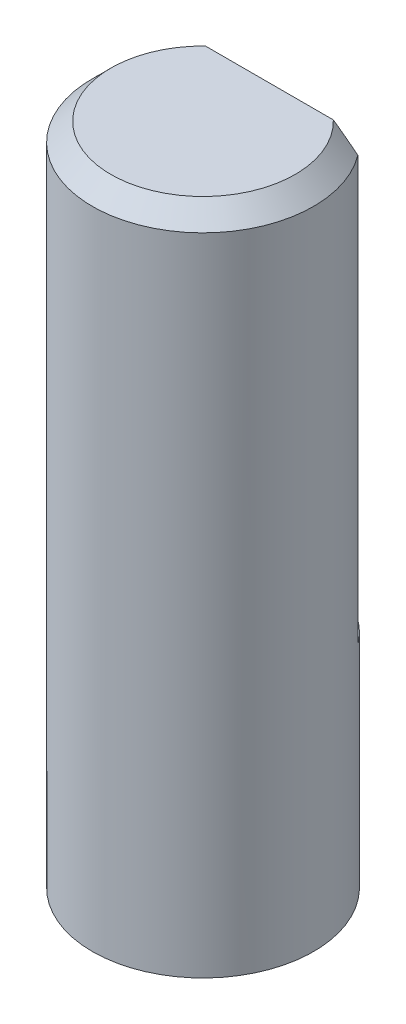
ISO-10303-21;
HEADER;
FILE_DESCRIPTION(('STEP AP214'),'2;1');
FILE_NAME('part.step','',(''),(''),'','','');
FILE_SCHEMA(('AUTOMOTIVE_DESIGN { 1 0 10303 214 1 1 1 1 }'));
ENDSEC;
DATA;
#1=APPLICATION_CONTEXT('core data for automotive mechanical design processes');
#2=APPLICATION_PROTOCOL_DEFINITION('international standard','automotive_design',2000,#1);
#3=PRODUCT_CONTEXT('',#1,'mechanical');
#4=PRODUCT('Part','Part','',(#3));
#5=PRODUCT_RELATED_PRODUCT_CATEGORY('part','',(#4));
#6=PRODUCT_DEFINITION_FORMATION('','',#4);
#7=PRODUCT_DEFINITION_CONTEXT('part definition',#1,'design');
#8=PRODUCT_DEFINITION('design','',#6,#7);
#9=PRODUCT_DEFINITION_SHAPE('','',#8);
#10=(LENGTH_UNIT() NAMED_UNIT(*) SI_UNIT(.MILLI.,.METRE.));
#11=(NAMED_UNIT(*) PLANE_ANGLE_UNIT() SI_UNIT($,.RADIAN.));
#12=(NAMED_UNIT(*) SI_UNIT($,.STERADIAN.) SOLID_ANGLE_UNIT());
#13=UNCERTAINTY_MEASURE_WITH_UNIT(LENGTH_MEASURE(1.E-05),#10,'distance_accuracy_value','');
#14=(GEOMETRIC_REPRESENTATION_CONTEXT(3) GLOBAL_UNCERTAINTY_ASSIGNED_CONTEXT((#13)) GLOBAL_UNIT_ASSIGNED_CONTEXT((#10,
#11,#12)) REPRESENTATION_CONTEXT('',''));
#15=CARTESIAN_POINT('',(0.,0.,0.));
#16=DIRECTION('',(0.,0.,1.));
#17=DIRECTION('',(1.,0.,0.));
#18=AXIS2_PLACEMENT_3D('',#15,#16,#17);
#19=CARTESIAN_POINT('',(0.,18.,0.));
#20=DIRECTION('',(0.,-1.,0.));
#21=DIRECTION('',(0.,0.,-1.));
#22=AXIS2_PLACEMENT_3D('',#19,#20,#21);
#23=CYLINDRICAL_SURFACE('',#22,3.);
#24=CARTESIAN_POINT('',(0.,17.5,0.));
#25=DIRECTION('',(0.,1.,0.));
#26=DIRECTION('',(0.,0.,1.));
#27=AXIS2_PLACEMENT_3D('',#24,#25,#26);
#28=CIRCLE('',#27,3.);
#29=CARTESIAN_POINT('',(2.4,17.5,-1.8));
#30=VERTEX_POINT('',#29);
#31=CARTESIAN_POINT('',(-2.4,17.5,-1.8));
#32=VERTEX_POINT('',#31);
#33=EDGE_CURVE('E94',#30,#32,#28,.F.);
#34=ORIENTED_EDGE('',*,*,#33,.T.);
#35=DIRECTION('',(0.,1.,0.));
#36=VECTOR('',#35,1.);
#37=CARTESIAN_POINT('',(-2.4,6.,-1.8));
#38=LINE('',#37,#36);
#39=CARTESIAN_POINT('',(-2.4,6.,-1.8));
#40=VERTEX_POINT('',#39);
#41=EDGE_CURVE('E59',#40,#32,#38,.T.);
#42=ORIENTED_EDGE('',*,*,#41,.F.);
#43=CARTESIAN_POINT('',(0.,6.,0.));
#44=DIRECTION('',(0.,1.,0.));
#45=DIRECTION('',(0.,0.,1.));
#46=AXIS2_PLACEMENT_3D('',#43,#44,#45);
#47=CIRCLE('',#46,3.);
#48=CARTESIAN_POINT('',(2.4,6.,-1.8));
#49=VERTEX_POINT('',#48);
#50=EDGE_CURVE('E79',#49,#40,#47,.T.);
#51=ORIENTED_EDGE('',*,*,#50,.F.);
#52=DIRECTION('',(0.,1.,0.));
#53=VECTOR('',#52,1.);
#54=CARTESIAN_POINT('',(2.4,6.,-1.8));
#55=LINE('',#54,#53);
#56=EDGE_CURVE('E70',#49,#30,#55,.T.);
#57=ORIENTED_EDGE('',*,*,#56,.T.);
#58=EDGE_LOOP('',(#34,#42,#51,#57));
#59=FACE_BOUND('',#58,.T.);
#60=CARTESIAN_POINT('',(0.,0.,0.));
#61=DIRECTION('',(0.,1.,0.));
#62=DIRECTION('',(0.,0.,1.));
#63=AXIS2_PLACEMENT_3D('',#60,#61,#62);
#64=CIRCLE('',#63,3.);
#65=CARTESIAN_POINT('',(0.,0.,3.));
#66=VERTEX_POINT('',#65);
#67=EDGE_CURVE('E88',#66,#66,#64,.T.);
#68=ORIENTED_EDGE('',*,*,#67,.T.);
#69=EDGE_LOOP('',(#68));
#70=FACE_BOUND('',#69,.T.);
#71=ADVANCED_FACE('F34',(#59,#70),#23,.T.);
#72=CARTESIAN_POINT('',(0.,18.,0.));
#73=DIRECTION('',(0.,1.,0.));
#74=DIRECTION('',(0.,0.,1.));
#75=AXIS2_PLACEMENT_3D('',#72,#73,#74);
#76=PLANE('',#75);
#77=DIRECTION('',(1.,0.,0.));
#78=VECTOR('',#77,1.);
#79=CARTESIAN_POINT('',(-2.4,18.,-1.8));
#80=LINE('',#79,#78);
#81=CARTESIAN_POINT('',(-1.73493515728975,18.,-1.8));
#82=VERTEX_POINT('',#81);
#83=CARTESIAN_POINT('',(1.73493515728975,18.,-1.8));
#84=VERTEX_POINT('',#83);
#85=EDGE_CURVE('E53',#82,#84,#80,.T.);
#86=ORIENTED_EDGE('',*,*,#85,.F.);
#87=CARTESIAN_POINT('',(0.,18.,0.));
#88=DIRECTION('',(0.,1.,0.));
#89=DIRECTION('',(0.,0.,1.));
#90=AXIS2_PLACEMENT_3D('',#87,#88,#89);
#91=CIRCLE('',#90,2.5);
#92=EDGE_CURVE('E92',#82,#84,#91,.T.);
#93=ORIENTED_EDGE('',*,*,#92,.T.);
#94=EDGE_LOOP('',(#86,#93));
#95=FACE_BOUND('',#94,.T.);
#96=ADVANCED_FACE('F98',(#95),#76,.T.);
#97=CARTESIAN_POINT('',(0.,0.,0.));
#98=DIRECTION('',(0.,1.,0.));
#99=DIRECTION('',(0.,0.,1.));
#100=AXIS2_PLACEMENT_3D('',#97,#98,#99);
#101=PLANE('',#100);
#102=ORIENTED_EDGE('',*,*,#67,.F.);
#103=EDGE_LOOP('',(#102));
#104=FACE_BOUND('',#103,.T.);
#105=ADVANCED_FACE('F100',(#104),#101,.F.);
#106=CARTESIAN_POINT('',(0.,18.,0.));
#107=DIRECTION('',(0.,-1.,0.));
#108=DIRECTION('',(0.,0.,-1.));
#109=AXIS2_PLACEMENT_3D('',#106,#107,#108);
#110=CONICAL_SURFACE('',#109,2.5,0.785398163397448);
#111=CARTESIAN_POINT('',(-5.29578284288328,14.9066721963596,-1.8));
#112=CARTESIAN_POINT('',(-5.12285180266291,15.0703540126584,-1.8));
#113=CARTESIAN_POINT('',(-4.94955019645599,15.2336504095275,-1.8));
#114=CARTESIAN_POINT('',(-4.60162438118305,15.5592473838574,-1.8));
#115=CARTESIAN_POINT('',(-4.42699883391852,15.7215465302245,-1.8));
#116=CARTESIAN_POINT('',(-4.06851224534989,16.0516608721901,-1.8));
#117=CARTESIAN_POINT('',(-3.88458392141662,16.2194031296405,-1.8));
#118=CARTESIAN_POINT('',(-3.51459877302508,16.552115561214,-1.8));
#119=CARTESIAN_POINT('',(-3.3285445876314,16.7170886526615,-1.8));
#120=CARTESIAN_POINT('',(-3.0469552865494,16.9613852102644,-1.8));
#121=CARTESIAN_POINT('',(-2.95274357195754,17.0422325960205,-1.8));
#122=CARTESIAN_POINT('',(-2.76320922654278,17.2026126022802,-1.8));
#123=CARTESIAN_POINT('',(-2.66788662596549,17.2821452584374,-1.8));
#124=CARTESIAN_POINT('',(-2.47547651174436,17.4397830383105,-1.8));
#125=CARTESIAN_POINT('',(-2.37838379128246,17.5178818262759,-1.8));
#126=CARTESIAN_POINT('',(-2.18237585089865,17.6717370747434,-1.8));
#127=CARTESIAN_POINT('',(-2.08346092711413,17.7474939105837,-1.8));
#128=CARTESIAN_POINT('',(-1.88532169174342,17.894219628657,-1.8));
#129=CARTESIAN_POINT('',(-1.78614736284381,17.9652556001344,-1.8));
#130=CARTESIAN_POINT('',(-1.5846683568887,18.1029700141344,-1.8));
#131=CARTESIAN_POINT('',(-1.48236132429949,18.1696450532922,-1.8));
#132=CARTESIAN_POINT('',(-1.27439518990201,18.2960736980376,-1.8));
#133=CARTESIAN_POINT('',(-1.1687613448564,18.355868364682,-1.8));
#134=CARTESIAN_POINT('',(-0.952556163795937,18.4656166003948,-1.8));
#135=CARTESIAN_POINT('',(-0.841995054764684,18.5155894860828,-1.8));
#136=CARTESIAN_POINT('',(-0.67571400546358,18.5779707744145,-1.8));
#137=CARTESIAN_POINT('',(-0.622180982305442,18.5962022888381,-1.8));
#138=CARTESIAN_POINT('',(-0.513910266480796,18.6287873383075,-1.8));
#139=CARTESIAN_POINT('',(-0.459172176697258,18.6431395736471,-1.8));
#140=CARTESIAN_POINT('',(-0.348992821062411,18.6672628138493,-1.8));
#141=CARTESIAN_POINT('',(-0.293556967868144,18.6770582049487,-1.8));
#142=CARTESIAN_POINT('',(-0.182034692593678,18.6916627606029,-1.8));
#143=CARTESIAN_POINT('',(-0.125948428950475,18.6964731147207,-1.8));
#144=CARTESIAN_POINT('',(-0.0132008668996252,18.7008386657294,-1.8));
#145=CARTESIAN_POINT('',(0.0434617950341464,18.7003593453081,-1.8));
#146=CARTESIAN_POINT('',(0.15648774149834,18.6940921780968,-1.8));
#147=CARTESIAN_POINT('',(0.212851022487892,18.6883042686605,-1.8));
#148=CARTESIAN_POINT('',(0.325096233526428,18.671724967809,-1.8));
#149=CARTESIAN_POINT('',(0.380974656979358,18.6609101918883,-1.8));
#150=CARTESIAN_POINT('',(0.491676832762132,18.6348327137508,-1.8));
#151=CARTESIAN_POINT('',(0.54650036964537,18.6195691129868,-1.8));
#152=CARTESIAN_POINT('',(0.688019766423603,18.5747703856724,-1.8));
#153=CARTESIAN_POINT('',(0.773755994279863,18.5422094516917,-1.8));
#154=CARTESIAN_POINT('',(0.942080002539032,18.4697969263594,-1.8));
#155=CARTESIAN_POINT('',(1.02466506086554,18.4299391967279,-1.8));
#156=CARTESIAN_POINT('',(1.18780091303287,18.3445424570655,-1.8));
#157=CARTESIAN_POINT('',(1.26832535988246,18.2989536643178,-1.8));
#158=CARTESIAN_POINT('',(1.38730526076978,18.2276412203138,-1.8));
#159=CARTESIAN_POINT('',(1.42665708647506,18.2033868873823,-1.8));
#160=CARTESIAN_POINT('',(1.50482372835086,18.15402980513,-1.8));
#161=CARTESIAN_POINT('',(1.54363856520485,18.1289270886157,-1.8));
#162=CARTESIAN_POINT('',(1.67182501563615,18.0443017298246,-1.8));
#163=CARTESIAN_POINT('',(1.76014213154034,17.9831809982279,-1.8));
#164=CARTESIAN_POINT('',(1.93475691237975,17.8581099630329,-1.8));
#165=CARTESIAN_POINT('',(2.02105414744676,17.7941590653449,-1.8));
#166=CARTESIAN_POINT('',(2.19210447719125,17.6641168712498,-1.8));
#167=CARTESIAN_POINT('',(2.2768565264644,17.5980242040805,-1.8));
#168=CARTESIAN_POINT('',(2.44508801948856,17.4642354600927,-1.8));
#169=CARTESIAN_POINT('',(2.52856739356204,17.3965392959989,-1.8));
#170=CARTESIAN_POINT('',(2.77799047736409,17.1911877411021,-1.8));
#171=CARTESIAN_POINT('',(2.94240007196368,17.0516713782478,-1.8));
#172=CARTESIAN_POINT('',(3.26843637260826,16.7695759942704,-1.8));
#173=CARTESIAN_POINT('',(3.43006413095913,16.6269981792333,-1.8));
#174=CARTESIAN_POINT('',(3.73546723091933,16.3539753142177,-1.8));
#175=CARTESIAN_POINT('',(3.87942213606178,16.2237307458772,-1.8));
#176=CARTESIAN_POINT('',(4.16619516720294,15.9619650961217,-1.8));
#177=CARTESIAN_POINT('',(4.30901315898711,15.830443867946,-1.8));
#178=CARTESIAN_POINT('',(4.59288247936315,15.5672779669628,-1.8));
#179=CARTESIAN_POINT('',(4.73393927099943,15.4356391790714,-1.8));
#180=CARTESIAN_POINT('',(5.0153431952258,15.1716466142537,-1.8));
#181=CARTESIAN_POINT('',(5.15569042994564,15.0392929462436,-1.8));
#182=CARTESIAN_POINT('',(5.29578284288328,14.9066721963596,-1.8));
#183=B_SPLINE_CURVE_WITH_KNOTS('',3,(#111,#112,#113,#114,#115,#116,#117,#118,#119,#120,#121,
#122,#123,#124,#125,#126,#127,#128,#129,#130,#131,#132,#133,#134,#135,#136,#137,#138,#139,#140,
#141,#142,#143,#144,#145,#146,#147,#148,#149,#150,#151,#152,#153,#154,#155,#156,#157,#158,#159,
#160,#161,#162,#163,#164,#165,#166,#167,#168,#169,#170,#171,#172,#173,#174,#175,#176,#177,#178,
#179,#180,#181,#182),.UNSPECIFIED.,.F.,.F.,(4,2,2,2,2,2,2,2,2,2,2,2,2,2,2,2,2,2,2,2,2,2,2,2,2,2,
2,2,2,2,2,2,2,2,2,4),(0.,0.714339121129969,1.4295359451444,2.17631800258365,2.92225648956363,
3.29468470304652,3.66710280016944,4.04089238896473,4.4146217576662,4.7805141986725,
5.14668886423431,5.51055046501753,5.8736891319736,6.04322842397081,6.21282444787905,
6.38150212030355,6.55013953245812,6.71987802063261,6.88961851190608,7.06015664612701,
7.23072924851931,7.50536044755127,7.7802237450112,8.05766521368626,8.19633537101629,
8.33500017216291,8.65712483021718,8.9793174302738,9.30172047707967,9.62414111215304,
10.2709512389679,10.9175110620876,11.4998923501344,12.0823413989977,12.6611581113517,
13.2398889942293),.UNSPECIFIED.);
#184=EDGE_CURVE('E11',#32,#82,#183,.T.);
#185=ORIENTED_EDGE('',*,*,#184,.F.);
#186=ORIENTED_EDGE('',*,*,#33,.F.);
#187=EDGE_CURVE('E39',#84,#30,#183,.T.);
#188=ORIENTED_EDGE('',*,*,#187,.F.);
#189=ORIENTED_EDGE('',*,*,#92,.F.);
#190=EDGE_LOOP('',(#185,#186,#188,#189));
#191=FACE_BOUND('',#190,.T.);
#192=ADVANCED_FACE('F36',(#191),#110,.T.);
#193=CARTESIAN_POINT('',(-2.4,6.,-1.8));
#194=DIRECTION('',(0.,0.,1.));
#195=DIRECTION('',(1.,0.,0.));
#196=AXIS2_PLACEMENT_3D('',#193,#194,#195);
#197=PLANE('',#196);
#198=ORIENTED_EDGE('',*,*,#184,.T.);
#199=ORIENTED_EDGE('',*,*,#85,.T.);
#200=ORIENTED_EDGE('',*,*,#187,.T.);
#201=ORIENTED_EDGE('',*,*,#56,.F.);
#202=DIRECTION('',(1.,0.,0.));
#203=VECTOR('',#202,1.);
#204=CARTESIAN_POINT('',(-2.4,6.,-1.8));
#205=LINE('',#204,#203);
#206=EDGE_CURVE('E73',#40,#49,#205,.T.);
#207=ORIENTED_EDGE('',*,*,#206,.F.);
#208=ORIENTED_EDGE('',*,*,#41,.T.);
#209=EDGE_LOOP('',(#198,#199,#200,#201,#207,#208));
#210=FACE_BOUND('',#209,.T.);
#211=ADVANCED_FACE('F72',(#210),#197,.F.);
#212=CARTESIAN_POINT('',(0.,6.,0.));
#213=DIRECTION('',(0.,1.,0.));
#214=DIRECTION('',(0.,0.,1.));
#215=AXIS2_PLACEMENT_3D('',#212,#213,#214);
#216=PLANE('',#215);
#217=ORIENTED_EDGE('',*,*,#206,.T.);
#218=ORIENTED_EDGE('',*,*,#50,.T.);
#219=EDGE_LOOP('',(#217,#218));
#220=FACE_BOUND('',#219,.T.);
#221=ADVANCED_FACE('F82',(#220),#216,.T.);
#222=CLOSED_SHELL('',(#71,#96,#105,#192,#211,#221));
#223=MANIFOLD_SOLID_BREP('B2',#222);
#224=ADVANCED_BREP_SHAPE_REPRESENTATION('',(#18,#223),#14);
#225=SHAPE_DEFINITION_REPRESENTATION(#9,#224);
ENDSEC;
END-ISO-10303-21;
